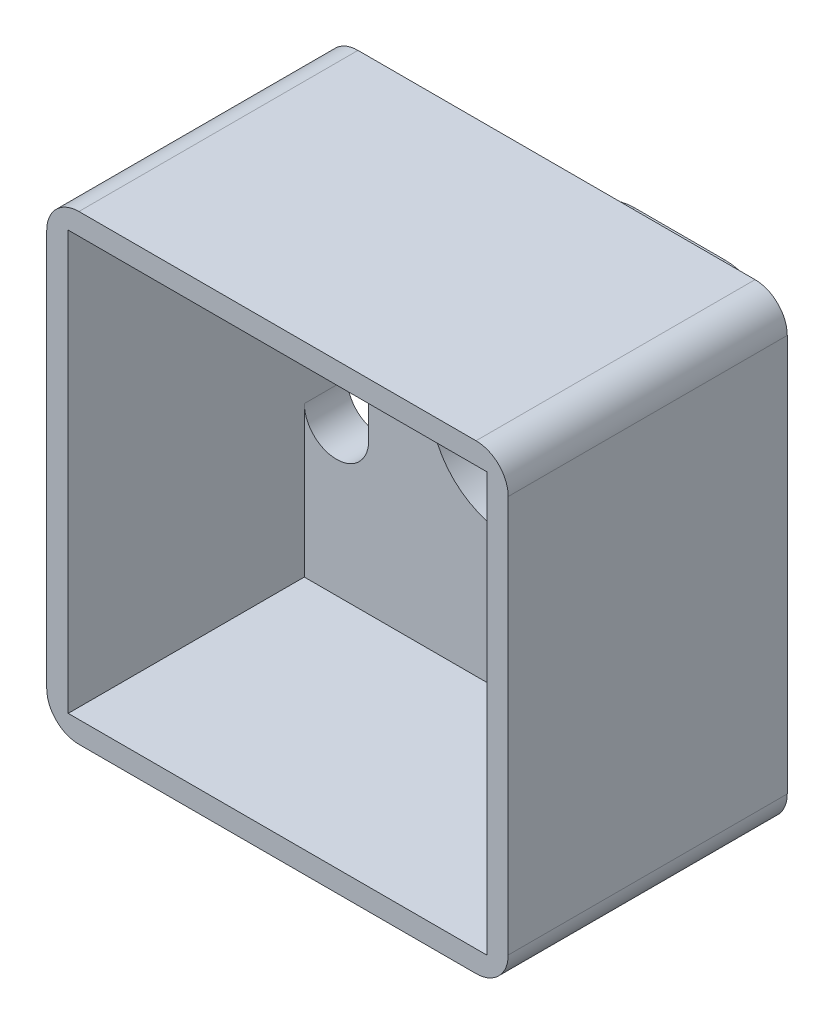
ISO-10303-21;
HEADER;
FILE_DESCRIPTION(('STEP AP214'),'2;1');
FILE_NAME('part.step','',(''),(''),'','','');
FILE_SCHEMA(('AUTOMOTIVE_DESIGN { 1 0 10303 214 1 1 1 1 }'));
ENDSEC;
DATA;
#1=APPLICATION_CONTEXT('core data for automotive mechanical design processes');
#2=APPLICATION_PROTOCOL_DEFINITION('international standard','automotive_design',2000,#1);
#3=PRODUCT_CONTEXT('',#1,'mechanical');
#4=PRODUCT('Part','Part','',(#3));
#5=PRODUCT_RELATED_PRODUCT_CATEGORY('part','',(#4));
#6=PRODUCT_DEFINITION_FORMATION('','',#4);
#7=PRODUCT_DEFINITION_CONTEXT('part definition',#1,'design');
#8=PRODUCT_DEFINITION('design','',#6,#7);
#9=PRODUCT_DEFINITION_SHAPE('','',#8);
#10=(LENGTH_UNIT() NAMED_UNIT(*) SI_UNIT(.MILLI.,.METRE.));
#11=(NAMED_UNIT(*) PLANE_ANGLE_UNIT() SI_UNIT($,.RADIAN.));
#12=(NAMED_UNIT(*) SI_UNIT($,.STERADIAN.) SOLID_ANGLE_UNIT());
#13=UNCERTAINTY_MEASURE_WITH_UNIT(LENGTH_MEASURE(1.E-05),#10,'distance_accuracy_value','');
#14=(GEOMETRIC_REPRESENTATION_CONTEXT(3) GLOBAL_UNCERTAINTY_ASSIGNED_CONTEXT((#13)) GLOBAL_UNIT_ASSIGNED_CONTEXT((#10,
#11,#12)) REPRESENTATION_CONTEXT('',''));
#15=CARTESIAN_POINT('',(0.,0.,0.));
#16=DIRECTION('',(0.,0.,1.));
#17=DIRECTION('',(1.,0.,0.));
#18=AXIS2_PLACEMENT_3D('',#15,#16,#17);
#19=CARTESIAN_POINT('',(-41.,-41.,38.));
#20=DIRECTION('',(0.,1.,0.));
#21=DIRECTION('',(-1.,0.,0.));
#22=AXIS2_PLACEMENT_3D('',#19,#20,#21);
#23=PLANE('',#22);
#24=DIRECTION('',(1.,0.,0.));
#25=VECTOR('',#24,1.);
#26=CARTESIAN_POINT('',(-41.,-41.,38.));
#27=LINE('',#26,#25);
#28=CARTESIAN_POINT('',(-38.,-41.,38.));
#29=VERTEX_POINT('',#28);
#30=CARTESIAN_POINT('',(-0.999999999999987,-41.,38.));
#31=VERTEX_POINT('',#30);
#32=EDGE_CURVE('E272',#29,#31,#27,.T.);
#33=ORIENTED_EDGE('',*,*,#32,.F.);
#34=DIRECTION('',(0.,0.,-1.));
#35=VECTOR('',#34,1.);
#36=CARTESIAN_POINT('',(-38.,-41.,12.));
#37=LINE('',#36,#35);
#38=CARTESIAN_POINT('',(-38.,-41.,12.));
#39=VERTEX_POINT('',#38);
#40=EDGE_CURVE('E11',#29,#39,#37,.T.);
#41=ORIENTED_EDGE('',*,*,#40,.T.);
#42=DIRECTION('',(-1.,0.,0.));
#43=VECTOR('',#42,1.);
#44=CARTESIAN_POINT('',(0.,-41.,12.));
#45=LINE('',#44,#43);
#46=CARTESIAN_POINT('',(-0.99999999999999,-41.,12.));
#47=VERTEX_POINT('',#46);
#48=EDGE_CURVE('E357',#47,#39,#45,.T.);
#49=ORIENTED_EDGE('',*,*,#48,.F.);
#50=DIRECTION('',(0.,0.,-1.));
#51=VECTOR('',#50,1.);
#52=CARTESIAN_POINT('',(-0.999999999999987,-41.,38.));
#53=LINE('',#52,#51);
#54=EDGE_CURVE('E50',#47,#31,#53,.F.);
#55=ORIENTED_EDGE('',*,*,#54,.T.);
#56=EDGE_LOOP('',(#33,#41,#49,#55));
#57=FACE_BOUND('',#56,.T.);
#58=ADVANCED_FACE('F39',(#57),#23,.F.);
#59=CARTESIAN_POINT('',(2.00000000000001,-41.,38.));
#60=DIRECTION('',(-1.,0.,0.));
#61=DIRECTION('',(0.,0.,1.));
#62=AXIS2_PLACEMENT_3D('',#59,#60,#61);
#63=PLANE('',#62);
#64=DIRECTION('',(0.,-1.,0.));
#65=VECTOR('',#64,1.);
#66=CARTESIAN_POINT('',(2.00000000000001,0.,12.));
#67=LINE('',#66,#65);
#68=CARTESIAN_POINT('',(2.00000000000001,-0.999999999999992,12.));
#69=VERTEX_POINT('',#68);
#70=CARTESIAN_POINT('',(2.00000000000001,-38.,12.));
#71=VERTEX_POINT('',#70);
#72=EDGE_CURVE('E232',#69,#71,#67,.T.);
#73=ORIENTED_EDGE('',*,*,#72,.F.);
#74=DIRECTION('',(0.,0.,-1.));
#75=VECTOR('',#74,1.);
#76=CARTESIAN_POINT('',(2.00000000000001,-0.999999999999992,38.));
#77=LINE('',#76,#75);
#78=CARTESIAN_POINT('',(2.00000000000001,-0.999999999999994,38.));
#79=VERTEX_POINT('',#78);
#80=EDGE_CURVE('E330',#69,#79,#77,.F.);
#81=ORIENTED_EDGE('',*,*,#80,.T.);
#82=DIRECTION('',(0.,1.,0.));
#83=VECTOR('',#82,1.);
#84=CARTESIAN_POINT('',(2.00000000000001,-41.,38.));
#85=LINE('',#84,#83);
#86=CARTESIAN_POINT('',(2.00000000000001,-38.,38.));
#87=VERTEX_POINT('',#86);
#88=EDGE_CURVE('E267',#87,#79,#85,.T.);
#89=ORIENTED_EDGE('',*,*,#88,.F.);
#90=DIRECTION('',(0.,0.,-1.));
#91=VECTOR('',#90,1.);
#92=CARTESIAN_POINT('',(2.00000000000001,-38.,38.));
#93=LINE('',#92,#91);
#94=EDGE_CURVE('E327',#87,#71,#93,.T.);
#95=ORIENTED_EDGE('',*,*,#94,.T.);
#96=EDGE_LOOP('',(#73,#81,#89,#95));
#97=FACE_BOUND('',#96,.T.);
#98=ADVANCED_FACE('F510',(#97),#63,.F.);
#99=CARTESIAN_POINT('',(-36.,-13.,0.));
#100=DIRECTION('',(0.,0.,1.));
#101=DIRECTION('',(1.,0.,0.));
#102=AXIS2_PLACEMENT_3D('',#99,#100,#101);
#103=CYLINDRICAL_SURFACE('',#102,3.);
#104=CARTESIAN_POINT('',(-36.,-13.,12.));
#105=DIRECTION('',(0.,0.,-1.));
#106=DIRECTION('',(-1.,0.,0.));
#107=AXIS2_PLACEMENT_3D('',#104,#105,#106);
#108=CIRCLE('',#107,3.);
#109=CARTESIAN_POINT('',(-33.,-13.,12.));
#110=VERTEX_POINT('',#109);
#111=CARTESIAN_POINT('',(-39.,-13.,12.));
#112=VERTEX_POINT('',#111);
#113=EDGE_CURVE('E226',#110,#112,#108,.F.);
#114=ORIENTED_EDGE('',*,*,#113,.F.);
#115=DIRECTION('',(0.,0.,1.));
#116=VECTOR('',#115,1.);
#117=CARTESIAN_POINT('',(-33.,-13.,0.));
#118=LINE('',#117,#116);
#119=CARTESIAN_POINT('',(-33.,-13.,16.));
#120=VERTEX_POINT('',#119);
#121=EDGE_CURVE('E241',#110,#120,#118,.T.);
#122=ORIENTED_EDGE('',*,*,#121,.T.);
#123=CARTESIAN_POINT('',(-36.,-13.,16.));
#124=DIRECTION('',(0.,0.,1.));
#125=DIRECTION('',(1.,0.,0.));
#126=AXIS2_PLACEMENT_3D('',#123,#124,#125);
#127=CIRCLE('',#126,3.);
#128=CARTESIAN_POINT('',(-39.,-13.,16.));
#129=VERTEX_POINT('',#128);
#130=EDGE_CURVE('E252',#129,#120,#127,.F.);
#131=ORIENTED_EDGE('',*,*,#130,.F.);
#132=DIRECTION('',(0.,0.,1.));
#133=VECTOR('',#132,1.);
#134=CARTESIAN_POINT('',(-39.,-13.,0.));
#135=LINE('',#134,#133);
#136=EDGE_CURVE('E243',#112,#129,#135,.T.);
#137=ORIENTED_EDGE('',*,*,#136,.F.);
#138=EDGE_LOOP('',(#114,#122,#131,#137));
#139=FACE_BOUND('',#138,.T.);
#140=ADVANCED_FACE('F237',(#139),#103,.F.);
#141=CARTESIAN_POINT('',(-33.,-13.,0.));
#142=DIRECTION('',(-1.,0.,0.));
#143=DIRECTION('',(0.,-1.,0.));
#144=AXIS2_PLACEMENT_3D('',#141,#142,#143);
#145=PLANE('',#144);
#146=ORIENTED_EDGE('',*,*,#121,.F.);
#147=DIRECTION('',(0.,1.,0.));
#148=VECTOR('',#147,1.);
#149=CARTESIAN_POINT('',(-33.,0.,12.));
#150=LINE('',#149,#148);
#151=CARTESIAN_POINT('',(-33.,-25.,12.));
#152=VERTEX_POINT('',#151);
#153=EDGE_CURVE('E225',#152,#110,#150,.T.);
#154=ORIENTED_EDGE('',*,*,#153,.F.);
#155=DIRECTION('',(0.,0.,1.));
#156=VECTOR('',#155,1.);
#157=CARTESIAN_POINT('',(-33.,-25.,0.));
#158=LINE('',#157,#156);
#159=CARTESIAN_POINT('',(-33.,-25.,16.));
#160=VERTEX_POINT('',#159);
#161=EDGE_CURVE('E249',#152,#160,#158,.T.);
#162=ORIENTED_EDGE('',*,*,#161,.T.);
#163=DIRECTION('',(0.,1.,0.));
#164=VECTOR('',#163,1.);
#165=CARTESIAN_POINT('',(-33.,-13.,16.));
#166=LINE('',#165,#164);
#167=EDGE_CURVE('E248',#160,#120,#166,.T.);
#168=ORIENTED_EDGE('',*,*,#167,.T.);
#169=EDGE_LOOP('',(#146,#154,#162,#168));
#170=FACE_BOUND('',#169,.T.);
#171=ADVANCED_FACE('F250',(#170),#145,.T.);
#172=CARTESIAN_POINT('',(-36.,-25.,0.));
#173=DIRECTION('',(0.,0.,1.));
#174=DIRECTION('',(1.,0.,0.));
#175=AXIS2_PLACEMENT_3D('',#172,#173,#174);
#176=CYLINDRICAL_SURFACE('',#175,3.);
#177=CARTESIAN_POINT('',(-36.,-25.,12.));
#178=DIRECTION('',(0.,0.,-1.));
#179=DIRECTION('',(-1.,0.,0.));
#180=AXIS2_PLACEMENT_3D('',#177,#178,#179);
#181=CIRCLE('',#180,3.);
#182=CARTESIAN_POINT('',(-39.,-25.,12.));
#183=VERTEX_POINT('',#182);
#184=EDGE_CURVE('E233',#183,#152,#181,.F.);
#185=ORIENTED_EDGE('',*,*,#184,.F.);
#186=DIRECTION('',(0.,0.,1.));
#187=VECTOR('',#186,1.);
#188=CARTESIAN_POINT('',(-39.,-25.,0.));
#189=LINE('',#188,#187);
#190=CARTESIAN_POINT('',(-39.,-25.,16.));
#191=VERTEX_POINT('',#190);
#192=EDGE_CURVE('E254',#183,#191,#189,.T.);
#193=ORIENTED_EDGE('',*,*,#192,.T.);
#194=CARTESIAN_POINT('',(-36.,-25.,16.));
#195=DIRECTION('',(0.,0.,1.));
#196=DIRECTION('',(1.,0.,0.));
#197=AXIS2_PLACEMENT_3D('',#194,#195,#196);
#198=CIRCLE('',#197,3.);
#199=EDGE_CURVE('E432',#160,#191,#198,.F.);
#200=ORIENTED_EDGE('',*,*,#199,.F.);
#201=ORIENTED_EDGE('',*,*,#161,.F.);
#202=EDGE_LOOP('',(#185,#193,#200,#201));
#203=FACE_BOUND('',#202,.T.);
#204=ADVANCED_FACE('F455',(#203),#176,.F.);
#205=CARTESIAN_POINT('',(-6.,0.,0.));
#206=DIRECTION('',(-1.,0.,0.));
#207=DIRECTION('',(0.,-1.,0.));
#208=AXIS2_PLACEMENT_3D('',#205,#206,#207);
#209=PLANE('',#208);
#210=DIRECTION('',(0.,-1.,0.));
#211=VECTOR('',#210,1.);
#212=CARTESIAN_POINT('',(-6.,0.,12.));
#213=LINE('',#212,#211);
#214=CARTESIAN_POINT('',(-6.,-13.,12.));
#215=VERTEX_POINT('',#214);
#216=CARTESIAN_POINT('',(-5.99999999999999,-25.,12.));
#217=VERTEX_POINT('',#216);
#218=EDGE_CURVE('E369',#215,#217,#213,.T.);
#219=ORIENTED_EDGE('',*,*,#218,.F.);
#220=DIRECTION('',(0.,0.,1.));
#221=VECTOR('',#220,1.);
#222=CARTESIAN_POINT('',(-6.,-13.,0.));
#223=LINE('',#222,#221);
#224=CARTESIAN_POINT('',(-6.,-13.,16.));
#225=VERTEX_POINT('',#224);
#226=EDGE_CURVE('E258',#215,#225,#223,.T.);
#227=ORIENTED_EDGE('',*,*,#226,.T.);
#228=DIRECTION('',(0.,1.,0.));
#229=VECTOR('',#228,1.);
#230=CARTESIAN_POINT('',(-6.,0.,16.));
#231=LINE('',#230,#229);
#232=CARTESIAN_POINT('',(-5.99999999999999,-25.,16.));
#233=VERTEX_POINT('',#232);
#234=EDGE_CURVE('E426',#233,#225,#231,.T.);
#235=ORIENTED_EDGE('',*,*,#234,.F.);
#236=DIRECTION('',(0.,0.,1.));
#237=VECTOR('',#236,1.);
#238=CARTESIAN_POINT('',(-5.99999999999999,-25.,0.));
#239=LINE('',#238,#237);
#240=EDGE_CURVE('E441',#217,#233,#239,.T.);
#241=ORIENTED_EDGE('',*,*,#240,.F.);
#242=EDGE_LOOP('',(#219,#227,#235,#241));
#243=FACE_BOUND('',#242,.T.);
#244=ADVANCED_FACE('F471',(#243),#209,.F.);
#245=CARTESIAN_POINT('',(-3.,-13.,0.));
#246=DIRECTION('',(0.,0.,1.));
#247=DIRECTION('',(1.,0.,0.));
#248=AXIS2_PLACEMENT_3D('',#245,#246,#247);
#249=CYLINDRICAL_SURFACE('',#248,3.);
#250=CARTESIAN_POINT('',(-3.,-13.,12.));
#251=DIRECTION('',(0.,0.,-1.));
#252=DIRECTION('',(-1.,0.,0.));
#253=AXIS2_PLACEMENT_3D('',#250,#251,#252);
#254=CIRCLE('',#253,3.);
#255=CARTESIAN_POINT('',(0.,-13.,12.));
#256=VERTEX_POINT('',#255);
#257=EDGE_CURVE('E368',#256,#215,#254,.F.);
#258=ORIENTED_EDGE('',*,*,#257,.F.);
#259=DIRECTION('',(0.,0.,1.));
#260=VECTOR('',#259,1.);
#261=CARTESIAN_POINT('',(0.,-13.,0.));
#262=LINE('',#261,#260);
#263=CARTESIAN_POINT('',(0.,-13.,16.));
#264=VERTEX_POINT('',#263);
#265=EDGE_CURVE('E444',#256,#264,#262,.T.);
#266=ORIENTED_EDGE('',*,*,#265,.T.);
#267=CARTESIAN_POINT('',(-3.,-13.,16.));
#268=DIRECTION('',(0.,0.,1.));
#269=DIRECTION('',(1.,0.,0.));
#270=AXIS2_PLACEMENT_3D('',#267,#268,#269);
#271=CIRCLE('',#270,3.);
#272=EDGE_CURVE('E431',#225,#264,#271,.F.);
#273=ORIENTED_EDGE('',*,*,#272,.F.);
#274=ORIENTED_EDGE('',*,*,#226,.F.);
#275=EDGE_LOOP('',(#258,#266,#273,#274));
#276=FACE_BOUND('',#275,.T.);
#277=ADVANCED_FACE('F480',(#276),#249,.F.);
#278=CARTESIAN_POINT('',(-3.,-25.,0.));
#279=DIRECTION('',(0.,0.,1.));
#280=DIRECTION('',(1.,0.,0.));
#281=AXIS2_PLACEMENT_3D('',#278,#279,#280);
#282=CYLINDRICAL_SURFACE('',#281,3.);
#283=CARTESIAN_POINT('',(-3.,-25.,12.));
#284=DIRECTION('',(0.,0.,-1.));
#285=DIRECTION('',(-1.,0.,0.));
#286=AXIS2_PLACEMENT_3D('',#283,#284,#285);
#287=CIRCLE('',#286,3.);
#288=CARTESIAN_POINT('',(0.,-25.,12.));
#289=VERTEX_POINT('',#288);
#290=EDGE_CURVE('E375',#217,#289,#287,.F.);
#291=ORIENTED_EDGE('',*,*,#290,.F.);
#292=ORIENTED_EDGE('',*,*,#240,.T.);
#293=CARTESIAN_POINT('',(-3.,-25.,16.));
#294=DIRECTION('',(0.,0.,1.));
#295=DIRECTION('',(1.,0.,0.));
#296=AXIS2_PLACEMENT_3D('',#293,#294,#295);
#297=CIRCLE('',#296,3.);
#298=CARTESIAN_POINT('',(0.,-25.,16.));
#299=VERTEX_POINT('',#298);
#300=EDGE_CURVE('E424',#299,#233,#297,.F.);
#301=ORIENTED_EDGE('',*,*,#300,.F.);
#302=DIRECTION('',(0.,0.,1.));
#303=VECTOR('',#302,1.);
#304=CARTESIAN_POINT('',(0.,-25.,0.));
#305=LINE('',#304,#303);
#306=EDGE_CURVE('E442',#289,#299,#305,.T.);
#307=ORIENTED_EDGE('',*,*,#306,.F.);
#308=EDGE_LOOP('',(#291,#292,#301,#307));
#309=FACE_BOUND('',#308,.T.);
#310=ADVANCED_FACE('F468',(#309),#282,.F.);
#311=CARTESIAN_POINT('',(-20.,-3.50676126122746,0.));
#312=DIRECTION('',(0.,0.,1.));
#313=DIRECTION('',(1.,0.,0.));
#314=AXIS2_PLACEMENT_3D('',#311,#312,#313);
#315=CYLINDRICAL_SURFACE('',#314,3.);
#316=CARTESIAN_POINT('',(-20.,-3.50676126122746,16.));
#317=DIRECTION('',(0.,0.,1.));
#318=DIRECTION('',(1.,0.,0.));
#319=AXIS2_PLACEMENT_3D('',#316,#317,#318);
#320=CIRCLE('',#319,3.);
#321=CARTESIAN_POINT('',(-17.,-3.50676126122746,16.));
#322=VERTEX_POINT('',#321);
#323=EDGE_CURVE('E274',#322,#322,#320,.F.);
#324=ORIENTED_EDGE('',*,*,#323,.F.);
#325=EDGE_LOOP('',(#324));
#326=FACE_BOUND('',#325,.T.);
#327=CARTESIAN_POINT('',(-20.,-3.50676126122746,12.));
#328=DIRECTION('',(0.,0.,-1.));
#329=DIRECTION('',(-1.,0.,0.));
#330=AXIS2_PLACEMENT_3D('',#327,#328,#329);
#331=CIRCLE('',#330,3.);
#332=CARTESIAN_POINT('',(-23.,-3.50676126122746,12.));
#333=VERTEX_POINT('',#332);
#334=EDGE_CURVE('E376',#333,#333,#331,.F.);
#335=ORIENTED_EDGE('',*,*,#334,.F.);
#336=EDGE_LOOP('',(#335));
#337=FACE_BOUND('',#336,.T.);
#338=ADVANCED_FACE('F708',(#326,#337),#315,.F.);
#339=CARTESIAN_POINT('',(0.,0.,0.));
#340=DIRECTION('',(0.,0.,-1.));
#341=DIRECTION('',(-1.,0.,0.));
#342=AXIS2_PLACEMENT_3D('',#339,#340,#341);
#343=PLANE('',#342);
#344=CARTESIAN_POINT('',(-20.,-19.,0.));
#345=DIRECTION('',(0.,0.,1.));
#346=DIRECTION('',(1.,0.,0.));
#347=AXIS2_PLACEMENT_3D('',#344,#345,#346);
#348=CIRCLE('',#347,7.25);
#349=CARTESIAN_POINT('',(-12.75,-19.,0.));
#350=VERTEX_POINT('',#349);
#351=EDGE_CURVE('E265',#350,#350,#348,.T.);
#352=ORIENTED_EDGE('',*,*,#351,.T.);
#353=EDGE_LOOP('',(#352));
#354=FACE_BOUND('',#353,.T.);
#355=DIRECTION('',(0.,-1.,0.));
#356=VECTOR('',#355,1.);
#357=CARTESIAN_POINT('',(-29.2125564669842,0.,0.));
#358=LINE('',#357,#356);
#359=CARTESIAN_POINT('',(-29.2125564669842,-14.8158524057952,0.));
#360=VERTEX_POINT('',#359);
#361=CARTESIAN_POINT('',(-29.2125564669842,-23.2158524057952,0.));
#362=VERTEX_POINT('',#361);
#363=EDGE_CURVE('E387',#360,#362,#358,.T.);
#364=ORIENTED_EDGE('',*,*,#363,.F.);
#365=CARTESIAN_POINT('',(-24.2125564669842,-14.8158524057952,0.));
#366=DIRECTION('',(0.,0.,-1.));
#367=DIRECTION('',(-1.,0.,0.));
#368=AXIS2_PLACEMENT_3D('',#365,#366,#367);
#369=CIRCLE('',#368,5.);
#370=CARTESIAN_POINT('',(-24.2125564669842,-9.81585240579516,0.));
#371=VERTEX_POINT('',#370);
#372=EDGE_CURVE('E290',#360,#371,#369,.T.);
#373=ORIENTED_EDGE('',*,*,#372,.T.);
#374=DIRECTION('',(1.,0.,0.));
#375=VECTOR('',#374,1.);
#376=CARTESIAN_POINT('',(0.,-9.81585240579516,0.));
#377=LINE('',#376,#375);
#378=CARTESIAN_POINT('',(-15.8125564669842,-9.81585240579516,0.));
#379=VERTEX_POINT('',#378);
#380=EDGE_CURVE('E384',#371,#379,#377,.T.);
#381=ORIENTED_EDGE('',*,*,#380,.T.);
#382=CARTESIAN_POINT('',(-15.8125564669842,-14.8158524057952,0.));
#383=DIRECTION('',(0.,0.,-1.));
#384=DIRECTION('',(-1.,0.,0.));
#385=AXIS2_PLACEMENT_3D('',#382,#383,#384);
#386=CIRCLE('',#385,5.);
#387=CARTESIAN_POINT('',(-10.8125564669842,-14.8158524057952,0.));
#388=VERTEX_POINT('',#387);
#389=EDGE_CURVE('E289',#379,#388,#386,.T.);
#390=ORIENTED_EDGE('',*,*,#389,.T.);
#391=DIRECTION('',(0.,-1.,0.));
#392=VECTOR('',#391,1.);
#393=CARTESIAN_POINT('',(-10.8125564669842,0.,0.));
#394=LINE('',#393,#392);
#395=CARTESIAN_POINT('',(-10.8125564669842,-23.2158524057952,0.));
#396=VERTEX_POINT('',#395);
#397=EDGE_CURVE('E379',#388,#396,#394,.T.);
#398=ORIENTED_EDGE('',*,*,#397,.T.);
#399=CARTESIAN_POINT('',(-15.8125564669842,-23.2158524057952,0.));
#400=DIRECTION('',(0.,0.,-1.));
#401=DIRECTION('',(-1.,0.,0.));
#402=AXIS2_PLACEMENT_3D('',#399,#400,#401);
#403=CIRCLE('',#402,5.);
#404=CARTESIAN_POINT('',(-15.8125564669842,-28.2158524057952,0.));
#405=VERTEX_POINT('',#404);
#406=EDGE_CURVE('E285',#396,#405,#403,.T.);
#407=ORIENTED_EDGE('',*,*,#406,.T.);
#408=DIRECTION('',(1.,0.,0.));
#409=VECTOR('',#408,1.);
#410=CARTESIAN_POINT('',(0.,-28.2158524057952,0.));
#411=LINE('',#410,#409);
#412=CARTESIAN_POINT('',(-24.2125564669842,-28.2158524057952,0.));
#413=VERTEX_POINT('',#412);
#414=EDGE_CURVE('E386',#413,#405,#411,.T.);
#415=ORIENTED_EDGE('',*,*,#414,.F.);
#416=CARTESIAN_POINT('',(-24.2125564669842,-23.2158524057952,0.));
#417=DIRECTION('',(0.,0.,-1.));
#418=DIRECTION('',(-1.,0.,0.));
#419=AXIS2_PLACEMENT_3D('',#416,#417,#418);
#420=CIRCLE('',#419,5.);
#421=EDGE_CURVE('E284',#413,#362,#420,.T.);
#422=ORIENTED_EDGE('',*,*,#421,.T.);
#423=EDGE_LOOP('',(#364,#373,#381,#390,#398,#407,#415,#422));
#424=FACE_BOUND('',#423,.T.);
#425=ADVANCED_FACE('F511',(#354,#424),#343,.T.);
#426=CARTESIAN_POINT('',(-39.,-13.,0.));
#427=DIRECTION('',(-1.,0.,0.));
#428=DIRECTION('',(0.,-1.,0.));
#429=AXIS2_PLACEMENT_3D('',#426,#427,#428);
#430=PLANE('',#429);
#431=DIRECTION('',(0.,-1.,0.));
#432=VECTOR('',#431,1.);
#433=CARTESIAN_POINT('',(-39.,0.,12.));
#434=LINE('',#433,#432);
#435=EDGE_CURVE('E242',#112,#183,#434,.T.);
#436=ORIENTED_EDGE('',*,*,#435,.F.);
#437=ORIENTED_EDGE('',*,*,#136,.T.);
#438=DIRECTION('',(0.,-1.,0.));
#439=VECTOR('',#438,1.);
#440=CARTESIAN_POINT('',(-39.,0.,16.));
#441=LINE('',#440,#439);
#442=CARTESIAN_POINT('',(-39.,0.,16.));
#443=VERTEX_POINT('',#442);
#444=EDGE_CURVE('E402',#443,#129,#441,.T.);
#445=ORIENTED_EDGE('',*,*,#444,.F.);
#446=DIRECTION('',(0.,0.,1.));
#447=VECTOR('',#446,1.);
#448=CARTESIAN_POINT('',(-39.,0.,16.));
#449=LINE('',#448,#447);
#450=CARTESIAN_POINT('',(-39.,0.,38.));
#451=VERTEX_POINT('',#450);
#452=EDGE_CURVE('E417',#443,#451,#449,.T.);
#453=ORIENTED_EDGE('',*,*,#452,.T.);
#454=DIRECTION('',(0.,-1.,0.));
#455=VECTOR('',#454,1.);
#456=CARTESIAN_POINT('',(-39.,-13.,38.));
#457=LINE('',#456,#455);
#458=CARTESIAN_POINT('',(-39.,-39.,38.));
#459=VERTEX_POINT('',#458);
#460=EDGE_CURVE('E259',#451,#459,#457,.T.);
#461=ORIENTED_EDGE('',*,*,#460,.T.);
#462=DIRECTION('',(0.,0.,1.));
#463=VECTOR('',#462,1.);
#464=CARTESIAN_POINT('',(-39.,-39.,16.));
#465=LINE('',#464,#463);
#466=CARTESIAN_POINT('',(-39.,-39.,16.));
#467=VERTEX_POINT('',#466);
#468=EDGE_CURVE('E415',#467,#459,#465,.T.);
#469=ORIENTED_EDGE('',*,*,#468,.F.);
#470=EDGE_CURVE('E396',#191,#467,#441,.T.);
#471=ORIENTED_EDGE('',*,*,#470,.F.);
#472=ORIENTED_EDGE('',*,*,#192,.F.);
#473=EDGE_LOOP('',(#436,#437,#445,#453,#461,#469,#471,#472));
#474=FACE_BOUND('',#473,.T.);
#475=ADVANCED_FACE('F459',(#474),#430,.F.);
#476=CARTESIAN_POINT('',(0.,0.,0.));
#477=DIRECTION('',(-1.,0.,0.));
#478=DIRECTION('',(0.,0.,1.));
#479=AXIS2_PLACEMENT_3D('',#476,#477,#478);
#480=PLANE('',#479);
#481=ORIENTED_EDGE('',*,*,#265,.F.);
#482=DIRECTION('',(0.,1.,0.));
#483=VECTOR('',#482,1.);
#484=CARTESIAN_POINT('',(0.,0.,12.));
#485=LINE('',#484,#483);
#486=EDGE_CURVE('E372',#289,#256,#485,.T.);
#487=ORIENTED_EDGE('',*,*,#486,.F.);
#488=ORIENTED_EDGE('',*,*,#306,.T.);
#489=DIRECTION('',(0.,1.,0.));
#490=VECTOR('',#489,1.);
#491=CARTESIAN_POINT('',(0.,-39.,16.));
#492=LINE('',#491,#490);
#493=CARTESIAN_POINT('',(0.,-39.,16.));
#494=VERTEX_POINT('',#493);
#495=EDGE_CURVE('E394',#494,#299,#492,.T.);
#496=ORIENTED_EDGE('',*,*,#495,.F.);
#497=DIRECTION('',(0.,0.,1.));
#498=VECTOR('',#497,1.);
#499=CARTESIAN_POINT('',(0.,-39.,16.));
#500=LINE('',#499,#498);
#501=CARTESIAN_POINT('',(0.,-39.,38.));
#502=VERTEX_POINT('',#501);
#503=EDGE_CURVE('E279',#494,#502,#500,.T.);
#504=ORIENTED_EDGE('',*,*,#503,.T.);
#505=DIRECTION('',(0.,-1.,0.));
#506=VECTOR('',#505,1.);
#507=CARTESIAN_POINT('',(0.,0.,38.));
#508=LINE('',#507,#506);
#509=CARTESIAN_POINT('',(0.,0.,38.));
#510=VERTEX_POINT('',#509);
#511=EDGE_CURVE('E439',#510,#502,#508,.T.);
#512=ORIENTED_EDGE('',*,*,#511,.F.);
#513=DIRECTION('',(0.,0.,1.));
#514=VECTOR('',#513,1.);
#515=CARTESIAN_POINT('',(0.,0.,16.));
#516=LINE('',#515,#514);
#517=CARTESIAN_POINT('',(0.,0.,16.));
#518=VERTEX_POINT('',#517);
#519=EDGE_CURVE('E410',#518,#510,#516,.T.);
#520=ORIENTED_EDGE('',*,*,#519,.F.);
#521=EDGE_CURVE('E399',#264,#518,#492,.T.);
#522=ORIENTED_EDGE('',*,*,#521,.F.);
#523=EDGE_LOOP('',(#481,#487,#488,#496,#504,#512,#520,#522));
#524=FACE_BOUND('',#523,.T.);
#525=ADVANCED_FACE('F482',(#524),#480,.T.);
#526=CARTESIAN_POINT('',(0.,0.,38.));
#527=DIRECTION('',(0.,0.,-1.));
#528=DIRECTION('',(-1.,0.,0.));
#529=AXIS2_PLACEMENT_3D('',#526,#527,#528);
#530=PLANE('',#529);
#531=ORIENTED_EDGE('',*,*,#88,.T.);
#532=CARTESIAN_POINT('',(-0.999999999999987,-0.999999999999992,38.));
#533=DIRECTION('',(0.,0.,-1.));
#534=DIRECTION('',(-1.,0.,0.));
#535=AXIS2_PLACEMENT_3D('',#532,#533,#534);
#536=CIRCLE('',#535,3.);
#537=CARTESIAN_POINT('',(-0.999999999999987,2.00000000000001,38.));
#538=VERTEX_POINT('',#537);
#539=EDGE_CURVE('E340',#79,#538,#536,.F.);
#540=ORIENTED_EDGE('',*,*,#539,.T.);
#541=DIRECTION('',(1.,0.,0.));
#542=VECTOR('',#541,1.);
#543=CARTESIAN_POINT('',(-41.,2.,38.));
#544=LINE('',#543,#542);
#545=CARTESIAN_POINT('',(-38.,2.,38.));
#546=VERTEX_POINT('',#545);
#547=EDGE_CURVE('E263',#546,#538,#544,.T.);
#548=ORIENTED_EDGE('',*,*,#547,.F.);
#549=CARTESIAN_POINT('',(-38.,-1.,38.));
#550=DIRECTION('',(0.,0.,-1.));
#551=DIRECTION('',(-1.,0.,0.));
#552=AXIS2_PLACEMENT_3D('',#549,#550,#551);
#553=CIRCLE('',#552,3.);
#554=CARTESIAN_POINT('',(-41.,-1.,38.));
#555=VERTEX_POINT('',#554);
#556=EDGE_CURVE('E331',#546,#555,#553,.F.);
#557=ORIENTED_EDGE('',*,*,#556,.T.);
#558=DIRECTION('',(0.,1.,0.));
#559=VECTOR('',#558,1.);
#560=CARTESIAN_POINT('',(-41.,-41.,38.));
#561=LINE('',#560,#559);
#562=CARTESIAN_POINT('',(-41.,-38.,38.));
#563=VERTEX_POINT('',#562);
#564=EDGE_CURVE('E261',#563,#555,#561,.T.);
#565=ORIENTED_EDGE('',*,*,#564,.F.);
#566=CARTESIAN_POINT('',(-38.,-38.,38.));
#567=DIRECTION('',(0.,0.,-1.));
#568=DIRECTION('',(-1.,0.,0.));
#569=AXIS2_PLACEMENT_3D('',#566,#567,#568);
#570=CIRCLE('',#569,3.);
#571=EDGE_CURVE('E58',#563,#29,#570,.F.);
#572=ORIENTED_EDGE('',*,*,#571,.T.);
#573=ORIENTED_EDGE('',*,*,#32,.T.);
#574=CARTESIAN_POINT('',(-0.99999999999999,-38.,38.));
#575=DIRECTION('',(0.,0.,-1.));
#576=DIRECTION('',(-1.,0.,0.));
#577=AXIS2_PLACEMENT_3D('',#574,#575,#576);
#578=CIRCLE('',#577,3.);
#579=EDGE_CURVE('E334',#31,#87,#578,.F.);
#580=ORIENTED_EDGE('',*,*,#579,.T.);
#581=EDGE_LOOP('',(#531,#540,#548,#557,#565,#572,#573,#580));
#582=FACE_BOUND('',#581,.T.);
#583=DIRECTION('',(-1.,0.,0.));
#584=VECTOR('',#583,1.);
#585=CARTESIAN_POINT('',(0.,0.,38.));
#586=LINE('',#585,#584);
#587=EDGE_CURVE('E378',#510,#451,#586,.T.);
#588=ORIENTED_EDGE('',*,*,#587,.F.);
#589=ORIENTED_EDGE('',*,*,#511,.T.);
#590=DIRECTION('',(1.,0.,0.));
#591=VECTOR('',#590,1.);
#592=CARTESIAN_POINT('',(-39.,-39.,38.));
#593=LINE('',#592,#591);
#594=EDGE_CURVE('E408',#459,#502,#593,.T.);
#595=ORIENTED_EDGE('',*,*,#594,.F.);
#596=ORIENTED_EDGE('',*,*,#460,.F.);
#597=EDGE_LOOP('',(#588,#589,#595,#596));
#598=FACE_BOUND('',#597,.T.);
#599=ADVANCED_FACE('F493',(#582,#598),#530,.F.);
#600=CARTESIAN_POINT('',(-20.,-19.,0.));
#601=DIRECTION('',(0.,0.,1.));
#602=DIRECTION('',(1.,0.,0.));
#603=AXIS2_PLACEMENT_3D('',#600,#601,#602);
#604=CYLINDRICAL_SURFACE('',#603,7.25);
#605=ORIENTED_EDGE('',*,*,#351,.F.);
#606=EDGE_LOOP('',(#605));
#607=FACE_BOUND('',#606,.T.);
#608=CARTESIAN_POINT('',(-20.,-19.,16.));
#609=DIRECTION('',(0.,0.,1.));
#610=DIRECTION('',(1.,0.,0.));
#611=AXIS2_PLACEMENT_3D('',#608,#609,#610);
#612=CIRCLE('',#611,7.25);
#613=CARTESIAN_POINT('',(-12.75,-19.,16.));
#614=VERTEX_POINT('',#613);
#615=EDGE_CURVE('E280',#614,#614,#612,.F.);
#616=ORIENTED_EDGE('',*,*,#615,.F.);
#617=EDGE_LOOP('',(#616));
#618=FACE_BOUND('',#617,.T.);
#619=ADVANCED_FACE('F491',(#607,#618),#604,.F.);
#620=CARTESIAN_POINT('',(-41.,-41.,38.));
#621=DIRECTION('',(-1.,0.,0.));
#622=DIRECTION('',(0.,0.,1.));
#623=AXIS2_PLACEMENT_3D('',#620,#621,#622);
#624=PLANE('',#623);
#625=ORIENTED_EDGE('',*,*,#564,.T.);
#626=DIRECTION('',(0.,0.,-1.));
#627=VECTOR('',#626,1.);
#628=CARTESIAN_POINT('',(-41.,-1.,38.));
#629=LINE('',#628,#627);
#630=CARTESIAN_POINT('',(-41.,-1.,12.));
#631=VERTEX_POINT('',#630);
#632=EDGE_CURVE('E342',#555,#631,#629,.T.);
#633=ORIENTED_EDGE('',*,*,#632,.T.);
#634=DIRECTION('',(0.,1.,0.));
#635=VECTOR('',#634,1.);
#636=CARTESIAN_POINT('',(-41.,0.,12.));
#637=LINE('',#636,#635);
#638=CARTESIAN_POINT('',(-41.,-38.,12.));
#639=VERTEX_POINT('',#638);
#640=EDGE_CURVE('E349',#639,#631,#637,.T.);
#641=ORIENTED_EDGE('',*,*,#640,.F.);
#642=DIRECTION('',(0.,0.,-1.));
#643=VECTOR('',#642,1.);
#644=CARTESIAN_POINT('',(-41.,-38.,38.));
#645=LINE('',#644,#643);
#646=EDGE_CURVE('E339',#639,#563,#645,.F.);
#647=ORIENTED_EDGE('',*,*,#646,.T.);
#648=EDGE_LOOP('',(#625,#633,#641,#647));
#649=FACE_BOUND('',#648,.T.);
#650=ADVANCED_FACE('F347',(#649),#624,.T.);
#651=CARTESIAN_POINT('',(-41.,2.,38.));
#652=DIRECTION('',(0.,1.,0.));
#653=DIRECTION('',(-1.,0.,0.));
#654=AXIS2_PLACEMENT_3D('',#651,#652,#653);
#655=PLANE('',#654);
#656=ORIENTED_EDGE('',*,*,#547,.T.);
#657=DIRECTION('',(0.,0.,-1.));
#658=VECTOR('',#657,1.);
#659=CARTESIAN_POINT('',(-0.999999999999987,2.00000000000001,12.));
#660=LINE('',#659,#658);
#661=CARTESIAN_POINT('',(-0.999999999999987,2.00000000000001,12.));
#662=VERTEX_POINT('',#661);
#663=EDGE_CURVE('E317',#538,#662,#660,.T.);
#664=ORIENTED_EDGE('',*,*,#663,.T.);
#665=DIRECTION('',(1.,0.,0.));
#666=VECTOR('',#665,1.);
#667=CARTESIAN_POINT('',(0.,2.00000000000001,12.));
#668=LINE('',#667,#666);
#669=CARTESIAN_POINT('',(-38.,2.,12.));
#670=VERTEX_POINT('',#669);
#671=EDGE_CURVE('E358',#670,#662,#668,.T.);
#672=ORIENTED_EDGE('',*,*,#671,.F.);
#673=DIRECTION('',(0.,0.,-1.));
#674=VECTOR('',#673,1.);
#675=CARTESIAN_POINT('',(-38.,2.,38.));
#676=LINE('',#675,#674);
#677=EDGE_CURVE('E313',#670,#546,#676,.F.);
#678=ORIENTED_EDGE('',*,*,#677,.T.);
#679=EDGE_LOOP('',(#656,#664,#672,#678));
#680=FACE_BOUND('',#679,.T.);
#681=ADVANCED_FACE('F517',(#680),#655,.T.);
#682=CARTESIAN_POINT('',(0.,0.,16.));
#683=DIRECTION('',(0.,0.,1.));
#684=DIRECTION('',(1.,0.,0.));
#685=AXIS2_PLACEMENT_3D('',#682,#683,#684);
#686=PLANE('',#685);
#687=ORIENTED_EDGE('',*,*,#323,.T.);
#688=EDGE_LOOP('',(#687));
#689=FACE_BOUND('',#688,.T.);
#690=ORIENTED_EDGE('',*,*,#615,.T.);
#691=EDGE_LOOP('',(#690));
#692=FACE_BOUND('',#691,.T.);
#693=ORIENTED_EDGE('',*,*,#130,.T.);
#694=ORIENTED_EDGE('',*,*,#167,.F.);
#695=ORIENTED_EDGE('',*,*,#199,.T.);
#696=ORIENTED_EDGE('',*,*,#470,.T.);
#697=DIRECTION('',(1.,0.,0.));
#698=VECTOR('',#697,1.);
#699=CARTESIAN_POINT('',(-39.,-39.,16.));
#700=LINE('',#699,#698);
#701=EDGE_CURVE('E404',#467,#494,#700,.T.);
#702=ORIENTED_EDGE('',*,*,#701,.T.);
#703=ORIENTED_EDGE('',*,*,#495,.T.);
#704=ORIENTED_EDGE('',*,*,#300,.T.);
#705=ORIENTED_EDGE('',*,*,#234,.T.);
#706=ORIENTED_EDGE('',*,*,#272,.T.);
#707=ORIENTED_EDGE('',*,*,#521,.T.);
#708=DIRECTION('',(-1.,0.,0.));
#709=VECTOR('',#708,1.);
#710=CARTESIAN_POINT('',(0.,0.,16.));
#711=LINE('',#710,#709);
#712=EDGE_CURVE('E398',#518,#443,#711,.T.);
#713=ORIENTED_EDGE('',*,*,#712,.T.);
#714=ORIENTED_EDGE('',*,*,#444,.T.);
#715=EDGE_LOOP('',(#693,#694,#695,#696,#702,#703,#704,#705,#706,#707,#713,#714));
#716=FACE_BOUND('',#715,.T.);
#717=ADVANCED_FACE('F456',(#689,#692,#716),#686,.T.);
#718=CARTESIAN_POINT('',(-39.,-39.,16.));
#719=DIRECTION('',(0.,-1.,0.));
#720=DIRECTION('',(1.,0.,0.));
#721=AXIS2_PLACEMENT_3D('',#718,#719,#720);
#722=PLANE('',#721);
#723=ORIENTED_EDGE('',*,*,#594,.T.);
#724=ORIENTED_EDGE('',*,*,#503,.F.);
#725=ORIENTED_EDGE('',*,*,#701,.F.);
#726=ORIENTED_EDGE('',*,*,#468,.T.);
#727=EDGE_LOOP('',(#723,#724,#725,#726));
#728=FACE_BOUND('',#727,.T.);
#729=ADVANCED_FACE('F464',(#728),#722,.F.);
#730=CARTESIAN_POINT('',(0.,0.,16.));
#731=DIRECTION('',(0.,1.,0.));
#732=DIRECTION('',(-1.,0.,0.));
#733=AXIS2_PLACEMENT_3D('',#730,#731,#732);
#734=PLANE('',#733);
#735=ORIENTED_EDGE('',*,*,#587,.T.);
#736=ORIENTED_EDGE('',*,*,#452,.F.);
#737=ORIENTED_EDGE('',*,*,#712,.F.);
#738=ORIENTED_EDGE('',*,*,#519,.T.);
#739=EDGE_LOOP('',(#735,#736,#737,#738));
#740=FACE_BOUND('',#739,.T.);
#741=ADVANCED_FACE('F486',(#740),#734,.F.);
#742=CARTESIAN_POINT('',(-10.8125564669842,0.,12.));
#743=DIRECTION('',(1.,0.,0.));
#744=DIRECTION('',(0.,0.,-1.));
#745=AXIS2_PLACEMENT_3D('',#742,#743,#744);
#746=PLANE('',#745);
#747=ORIENTED_EDGE('',*,*,#397,.F.);
#748=DIRECTION('',(0.,0.,-1.));
#749=VECTOR('',#748,1.);
#750=CARTESIAN_POINT('',(-10.8125564669842,-14.8158524057952,12.));
#751=LINE('',#750,#749);
#752=CARTESIAN_POINT('',(-10.8125564669842,-14.8158524057952,12.));
#753=VERTEX_POINT('',#752);
#754=EDGE_CURVE('E299',#388,#753,#751,.F.);
#755=ORIENTED_EDGE('',*,*,#754,.T.);
#756=DIRECTION('',(0.,-1.,0.));
#757=VECTOR('',#756,1.);
#758=CARTESIAN_POINT('',(-10.8125564669842,0.,12.));
#759=LINE('',#758,#757);
#760=CARTESIAN_POINT('',(-10.8125564669842,-23.2158524057952,12.));
#761=VERTEX_POINT('',#760);
#762=EDGE_CURVE('E392',#753,#761,#759,.T.);
#763=ORIENTED_EDGE('',*,*,#762,.T.);
#764=DIRECTION('',(0.,0.,-1.));
#765=VECTOR('',#764,1.);
#766=CARTESIAN_POINT('',(-10.8125564669842,-23.2158524057952,0.));
#767=LINE('',#766,#765);
#768=EDGE_CURVE('E298',#761,#396,#767,.T.);
#769=ORIENTED_EDGE('',*,*,#768,.T.);
#770=EDGE_LOOP('',(#747,#755,#763,#769));
#771=FACE_BOUND('',#770,.T.);
#772=ADVANCED_FACE('F642',(#771),#746,.T.);
#773=CARTESIAN_POINT('',(0.,-28.2158524057952,12.));
#774=DIRECTION('',(0.,1.,0.));
#775=DIRECTION('',(0.,0.,1.));
#776=AXIS2_PLACEMENT_3D('',#773,#774,#775);
#777=PLANE('',#776);
#778=ORIENTED_EDGE('',*,*,#414,.T.);
#779=DIRECTION('',(0.,0.,-1.));
#780=VECTOR('',#779,1.);
#781=CARTESIAN_POINT('',(-15.8125564669842,-28.2158524057952,12.));
#782=LINE('',#781,#780);
#783=CARTESIAN_POINT('',(-15.8125564669842,-28.2158524057952,12.));
#784=VERTEX_POINT('',#783);
#785=EDGE_CURVE('E302',#405,#784,#782,.F.);
#786=ORIENTED_EDGE('',*,*,#785,.T.);
#787=DIRECTION('',(1.,0.,0.));
#788=VECTOR('',#787,1.);
#789=CARTESIAN_POINT('',(0.,-28.2158524057952,12.));
#790=LINE('',#789,#788);
#791=CARTESIAN_POINT('',(-24.2125564669842,-28.2158524057952,12.));
#792=VERTEX_POINT('',#791);
#793=EDGE_CURVE('E359',#792,#784,#790,.T.);
#794=ORIENTED_EDGE('',*,*,#793,.F.);
#795=DIRECTION('',(0.,0.,-1.));
#796=VECTOR('',#795,1.);
#797=CARTESIAN_POINT('',(-24.2125564669842,-28.2158524057952,12.));
#798=LINE('',#797,#796);
#799=EDGE_CURVE('E301',#792,#413,#798,.T.);
#800=ORIENTED_EDGE('',*,*,#799,.T.);
#801=EDGE_LOOP('',(#778,#786,#794,#800));
#802=FACE_BOUND('',#801,.T.);
#803=ADVANCED_FACE('F631',(#802),#777,.F.);
#804=CARTESIAN_POINT('',(-29.2125564669842,0.,12.));
#805=DIRECTION('',(1.,0.,0.));
#806=DIRECTION('',(0.,0.,-1.));
#807=AXIS2_PLACEMENT_3D('',#804,#805,#806);
#808=PLANE('',#807);
#809=DIRECTION('',(0.,-1.,0.));
#810=VECTOR('',#809,1.);
#811=CARTESIAN_POINT('',(-29.2125564669842,0.,12.));
#812=LINE('',#811,#810);
#813=CARTESIAN_POINT('',(-29.2125564669842,-14.8158524057952,12.));
#814=VERTEX_POINT('',#813);
#815=CARTESIAN_POINT('',(-29.2125564669842,-23.2158524057952,12.));
#816=VERTEX_POINT('',#815);
#817=EDGE_CURVE('E817',#814,#816,#812,.T.);
#818=ORIENTED_EDGE('',*,*,#817,.F.);
#819=DIRECTION('',(0.,0.,-1.));
#820=VECTOR('',#819,1.);
#821=CARTESIAN_POINT('',(-29.2125564669842,-14.8158524057952,0.));
#822=LINE('',#821,#820);
#823=EDGE_CURVE('E278',#814,#360,#822,.T.);
#824=ORIENTED_EDGE('',*,*,#823,.T.);
#825=ORIENTED_EDGE('',*,*,#363,.T.);
#826=DIRECTION('',(0.,0.,-1.));
#827=VECTOR('',#826,1.);
#828=CARTESIAN_POINT('',(-29.2125564669842,-23.2158524057952,12.));
#829=LINE('',#828,#827);
#830=EDGE_CURVE('E271',#362,#816,#829,.F.);
#831=ORIENTED_EDGE('',*,*,#830,.T.);
#832=EDGE_LOOP('',(#818,#824,#825,#831));
#833=FACE_BOUND('',#832,.T.);
#834=ADVANCED_FACE('F623',(#833),#808,.F.);
#835=CARTESIAN_POINT('',(0.,-9.81585240579516,12.));
#836=DIRECTION('',(0.,1.,0.));
#837=DIRECTION('',(0.,0.,1.));
#838=AXIS2_PLACEMENT_3D('',#835,#836,#837);
#839=PLANE('',#838);
#840=ORIENTED_EDGE('',*,*,#380,.F.);
#841=DIRECTION('',(0.,0.,-1.));
#842=VECTOR('',#841,1.);
#843=CARTESIAN_POINT('',(-24.2125564669842,-9.81585240579516,12.));
#844=LINE('',#843,#842);
#845=CARTESIAN_POINT('',(-24.2125564669842,-9.81585240579516,12.));
#846=VERTEX_POINT('',#845);
#847=EDGE_CURVE('E295',#371,#846,#844,.F.);
#848=ORIENTED_EDGE('',*,*,#847,.T.);
#849=DIRECTION('',(1.,0.,0.));
#850=VECTOR('',#849,1.);
#851=CARTESIAN_POINT('',(0.,-9.81585240579516,12.));
#852=LINE('',#851,#850);
#853=CARTESIAN_POINT('',(-15.8125564669842,-9.81585240579516,12.));
#854=VERTEX_POINT('',#853);
#855=EDGE_CURVE('E825',#846,#854,#852,.T.);
#856=ORIENTED_EDGE('',*,*,#855,.T.);
#857=DIRECTION('',(0.,0.,-1.));
#858=VECTOR('',#857,1.);
#859=CARTESIAN_POINT('',(-15.8125564669842,-9.81585240579516,12.));
#860=LINE('',#859,#858);
#861=EDGE_CURVE('E293',#854,#379,#860,.T.);
#862=ORIENTED_EDGE('',*,*,#861,.T.);
#863=EDGE_LOOP('',(#840,#848,#856,#862));
#864=FACE_BOUND('',#863,.T.);
#865=ADVANCED_FACE('F614',(#864),#839,.T.);
#866=CARTESIAN_POINT('',(0.,0.,12.));
#867=DIRECTION('',(0.,0.,-1.));
#868=DIRECTION('',(-1.,0.,0.));
#869=AXIS2_PLACEMENT_3D('',#866,#867,#868);
#870=PLANE('',#869);
#871=ORIENTED_EDGE('',*,*,#762,.F.);
#872=CARTESIAN_POINT('',(-15.8125564669842,-14.8158524057952,12.));
#873=DIRECTION('',(0.,0.,-1.));
#874=DIRECTION('',(-1.,0.,0.));
#875=AXIS2_PLACEMENT_3D('',#872,#873,#874);
#876=CIRCLE('',#875,5.);
#877=EDGE_CURVE('E308',#753,#854,#876,.F.);
#878=ORIENTED_EDGE('',*,*,#877,.T.);
#879=ORIENTED_EDGE('',*,*,#855,.F.);
#880=CARTESIAN_POINT('',(-24.2125564669842,-14.8158524057952,12.));
#881=DIRECTION('',(0.,0.,-1.));
#882=DIRECTION('',(-1.,0.,0.));
#883=AXIS2_PLACEMENT_3D('',#880,#881,#882);
#884=CIRCLE('',#883,5.);
#885=EDGE_CURVE('E306',#846,#814,#884,.F.);
#886=ORIENTED_EDGE('',*,*,#885,.T.);
#887=ORIENTED_EDGE('',*,*,#817,.T.);
#888=CARTESIAN_POINT('',(-24.2125564669842,-23.2158524057952,12.));
#889=DIRECTION('',(0.,0.,-1.));
#890=DIRECTION('',(-1.,0.,0.));
#891=AXIS2_PLACEMENT_3D('',#888,#889,#890);
#892=CIRCLE('',#891,5.);
#893=EDGE_CURVE('E315',#816,#792,#892,.F.);
#894=ORIENTED_EDGE('',*,*,#893,.T.);
#895=ORIENTED_EDGE('',*,*,#793,.T.);
#896=CARTESIAN_POINT('',(-15.8125564669842,-23.2158524057952,12.));
#897=DIRECTION('',(0.,0.,-1.));
#898=DIRECTION('',(-1.,0.,0.));
#899=AXIS2_PLACEMENT_3D('',#896,#897,#898);
#900=CIRCLE('',#899,5.);
#901=EDGE_CURVE('E309',#784,#761,#900,.F.);
#902=ORIENTED_EDGE('',*,*,#901,.T.);
#903=EDGE_LOOP('',(#871,#878,#879,#886,#887,#894,#895,#902));
#904=FACE_BOUND('',#903,.T.);
#905=ORIENTED_EDGE('',*,*,#671,.T.);
#906=CARTESIAN_POINT('',(-0.999999999999987,-0.999999999999992,12.));
#907=DIRECTION('',(0.,0.,-1.));
#908=DIRECTION('',(-1.,0.,0.));
#909=AXIS2_PLACEMENT_3D('',#906,#907,#908);
#910=CIRCLE('',#909,3.);
#911=EDGE_CURVE('E323',#662,#69,#910,.T.);
#912=ORIENTED_EDGE('',*,*,#911,.T.);
#913=ORIENTED_EDGE('',*,*,#72,.T.);
#914=CARTESIAN_POINT('',(-0.99999999999999,-38.,12.));
#915=DIRECTION('',(0.,0.,-1.));
#916=DIRECTION('',(-1.,0.,0.));
#917=AXIS2_PLACEMENT_3D('',#914,#915,#916);
#918=CIRCLE('',#917,3.);
#919=EDGE_CURVE('E316',#71,#47,#918,.T.);
#920=ORIENTED_EDGE('',*,*,#919,.T.);
#921=ORIENTED_EDGE('',*,*,#48,.T.);
#922=CARTESIAN_POINT('',(-38.,-38.,12.));
#923=DIRECTION('',(0.,0.,-1.));
#924=DIRECTION('',(-1.,0.,0.));
#925=AXIS2_PLACEMENT_3D('',#922,#923,#924);
#926=CIRCLE('',#925,3.);
#927=EDGE_CURVE('E322',#39,#639,#926,.T.);
#928=ORIENTED_EDGE('',*,*,#927,.T.);
#929=ORIENTED_EDGE('',*,*,#640,.T.);
#930=CARTESIAN_POINT('',(-38.,-1.,12.));
#931=DIRECTION('',(0.,0.,-1.));
#932=DIRECTION('',(-1.,0.,0.));
#933=AXIS2_PLACEMENT_3D('',#930,#931,#932);
#934=CIRCLE('',#933,3.);
#935=EDGE_CURVE('E324',#631,#670,#934,.T.);
#936=ORIENTED_EDGE('',*,*,#935,.T.);
#937=EDGE_LOOP('',(#905,#912,#913,#920,#921,#928,#929,#936));
#938=FACE_BOUND('',#937,.T.);
#939=ORIENTED_EDGE('',*,*,#153,.T.);
#940=ORIENTED_EDGE('',*,*,#113,.T.);
#941=ORIENTED_EDGE('',*,*,#435,.T.);
#942=ORIENTED_EDGE('',*,*,#184,.T.);
#943=EDGE_LOOP('',(#939,#940,#941,#942));
#944=FACE_BOUND('',#943,.T.);
#945=ORIENTED_EDGE('',*,*,#257,.T.);
#946=ORIENTED_EDGE('',*,*,#218,.T.);
#947=ORIENTED_EDGE('',*,*,#290,.T.);
#948=ORIENTED_EDGE('',*,*,#486,.T.);
#949=EDGE_LOOP('',(#945,#946,#947,#948));
#950=FACE_BOUND('',#949,.T.);
#951=ORIENTED_EDGE('',*,*,#334,.T.);
#952=EDGE_LOOP('',(#951));
#953=FACE_BOUND('',#952,.T.);
#954=ADVANCED_FACE('F228',(#904,#938,#944,#950,#953),#870,.T.);
#955=CARTESIAN_POINT('',(-24.2125564669842,-14.8158524057952,12.));
#956=DIRECTION('',(0.,0.,1.));
#957=DIRECTION('',(1.,0.,0.));
#958=AXIS2_PLACEMENT_3D('',#955,#956,#957);
#959=CYLINDRICAL_SURFACE('',#958,5.);
#960=ORIENTED_EDGE('',*,*,#885,.F.);
#961=ORIENTED_EDGE('',*,*,#847,.F.);
#962=ORIENTED_EDGE('',*,*,#372,.F.);
#963=ORIENTED_EDGE('',*,*,#823,.F.);
#964=EDGE_LOOP('',(#960,#961,#962,#963));
#965=FACE_BOUND('',#964,.T.);
#966=ADVANCED_FACE('F521',(#965),#959,.T.);
#967=CARTESIAN_POINT('',(-15.8125564669842,-14.8158524057952,12.));
#968=DIRECTION('',(0.,0.,-1.));
#969=DIRECTION('',(-1.,0.,0.));
#970=AXIS2_PLACEMENT_3D('',#967,#968,#969);
#971=CYLINDRICAL_SURFACE('',#970,5.);
#972=ORIENTED_EDGE('',*,*,#877,.F.);
#973=ORIENTED_EDGE('',*,*,#754,.F.);
#974=ORIENTED_EDGE('',*,*,#389,.F.);
#975=ORIENTED_EDGE('',*,*,#861,.F.);
#976=EDGE_LOOP('',(#972,#973,#974,#975));
#977=FACE_BOUND('',#976,.T.);
#978=ADVANCED_FACE('F523',(#977),#971,.T.);
#979=CARTESIAN_POINT('',(-15.8125564669842,-23.2158524057952,12.));
#980=DIRECTION('',(0.,0.,1.));
#981=DIRECTION('',(1.,0.,0.));
#982=AXIS2_PLACEMENT_3D('',#979,#980,#981);
#983=CYLINDRICAL_SURFACE('',#982,5.);
#984=ORIENTED_EDGE('',*,*,#901,.F.);
#985=ORIENTED_EDGE('',*,*,#785,.F.);
#986=ORIENTED_EDGE('',*,*,#406,.F.);
#987=ORIENTED_EDGE('',*,*,#768,.F.);
#988=EDGE_LOOP('',(#984,#985,#986,#987));
#989=FACE_BOUND('',#988,.T.);
#990=ADVANCED_FACE('F527',(#989),#983,.T.);
#991=CARTESIAN_POINT('',(-24.2125564669842,-23.2158524057952,12.));
#992=DIRECTION('',(0.,0.,-1.));
#993=DIRECTION('',(-1.,0.,0.));
#994=AXIS2_PLACEMENT_3D('',#991,#992,#993);
#995=CYLINDRICAL_SURFACE('',#994,5.);
#996=ORIENTED_EDGE('',*,*,#893,.F.);
#997=ORIENTED_EDGE('',*,*,#830,.F.);
#998=ORIENTED_EDGE('',*,*,#421,.F.);
#999=ORIENTED_EDGE('',*,*,#799,.F.);
#1000=EDGE_LOOP('',(#996,#997,#998,#999));
#1001=FACE_BOUND('',#1000,.T.);
#1002=ADVANCED_FACE('F535',(#1001),#995,.T.);
#1003=CARTESIAN_POINT('',(-0.999999999999987,-0.999999999999992,38.));
#1004=DIRECTION('',(0.,0.,1.));
#1005=DIRECTION('',(1.,0.,0.));
#1006=AXIS2_PLACEMENT_3D('',#1003,#1004,#1005);
#1007=CYLINDRICAL_SURFACE('',#1006,3.);
#1008=ORIENTED_EDGE('',*,*,#539,.F.);
#1009=ORIENTED_EDGE('',*,*,#80,.F.);
#1010=ORIENTED_EDGE('',*,*,#911,.F.);
#1011=ORIENTED_EDGE('',*,*,#663,.F.);
#1012=EDGE_LOOP('',(#1008,#1009,#1010,#1011));
#1013=FACE_BOUND('',#1012,.T.);
#1014=ADVANCED_FACE('F533',(#1013),#1007,.T.);
#1015=CARTESIAN_POINT('',(-38.,-1.,38.));
#1016=DIRECTION('',(0.,0.,-1.));
#1017=DIRECTION('',(-1.,0.,0.));
#1018=AXIS2_PLACEMENT_3D('',#1015,#1016,#1017);
#1019=CYLINDRICAL_SURFACE('',#1018,3.);
#1020=ORIENTED_EDGE('',*,*,#556,.F.);
#1021=ORIENTED_EDGE('',*,*,#677,.F.);
#1022=ORIENTED_EDGE('',*,*,#935,.F.);
#1023=ORIENTED_EDGE('',*,*,#632,.F.);
#1024=EDGE_LOOP('',(#1020,#1021,#1022,#1023));
#1025=FACE_BOUND('',#1024,.T.);
#1026=ADVANCED_FACE('F536',(#1025),#1019,.T.);
#1027=CARTESIAN_POINT('',(-38.,-38.,38.));
#1028=DIRECTION('',(0.,0.,1.));
#1029=DIRECTION('',(1.,0.,0.));
#1030=AXIS2_PLACEMENT_3D('',#1027,#1028,#1029);
#1031=CYLINDRICAL_SURFACE('',#1030,3.);
#1032=ORIENTED_EDGE('',*,*,#571,.F.);
#1033=ORIENTED_EDGE('',*,*,#646,.F.);
#1034=ORIENTED_EDGE('',*,*,#927,.F.);
#1035=ORIENTED_EDGE('',*,*,#40,.F.);
#1036=EDGE_LOOP('',(#1032,#1033,#1034,#1035));
#1037=FACE_BOUND('',#1036,.T.);
#1038=ADVANCED_FACE('F542',(#1037),#1031,.T.);
#1039=CARTESIAN_POINT('',(-0.99999999999999,-38.,38.));
#1040=DIRECTION('',(0.,0.,-1.));
#1041=DIRECTION('',(-1.,0.,0.));
#1042=AXIS2_PLACEMENT_3D('',#1039,#1040,#1041);
#1043=CYLINDRICAL_SURFACE('',#1042,3.);
#1044=ORIENTED_EDGE('',*,*,#579,.F.);
#1045=ORIENTED_EDGE('',*,*,#54,.F.);
#1046=ORIENTED_EDGE('',*,*,#919,.F.);
#1047=ORIENTED_EDGE('',*,*,#94,.F.);
#1048=EDGE_LOOP('',(#1044,#1045,#1046,#1047));
#1049=FACE_BOUND('',#1048,.T.);
#1050=ADVANCED_FACE('F41',(#1049),#1043,.T.);
#1051=CLOSED_SHELL('',(#58,#98,#140,#171,#204,#244,#277,#310,#338,#425,#475,#525,#599,#619,#650,
#681,#717,#729,#741,#772,#803,#834,#865,#954,#966,#978,#990,#1002,#1014,#1026,#1038,#1050));
#1052=MANIFOLD_SOLID_BREP('B2',#1051);
#1053=ADVANCED_BREP_SHAPE_REPRESENTATION('',(#18,#1052),#14);
#1054=SHAPE_DEFINITION_REPRESENTATION(#9,#1053);
ENDSEC;
END-ISO-10303-21;
